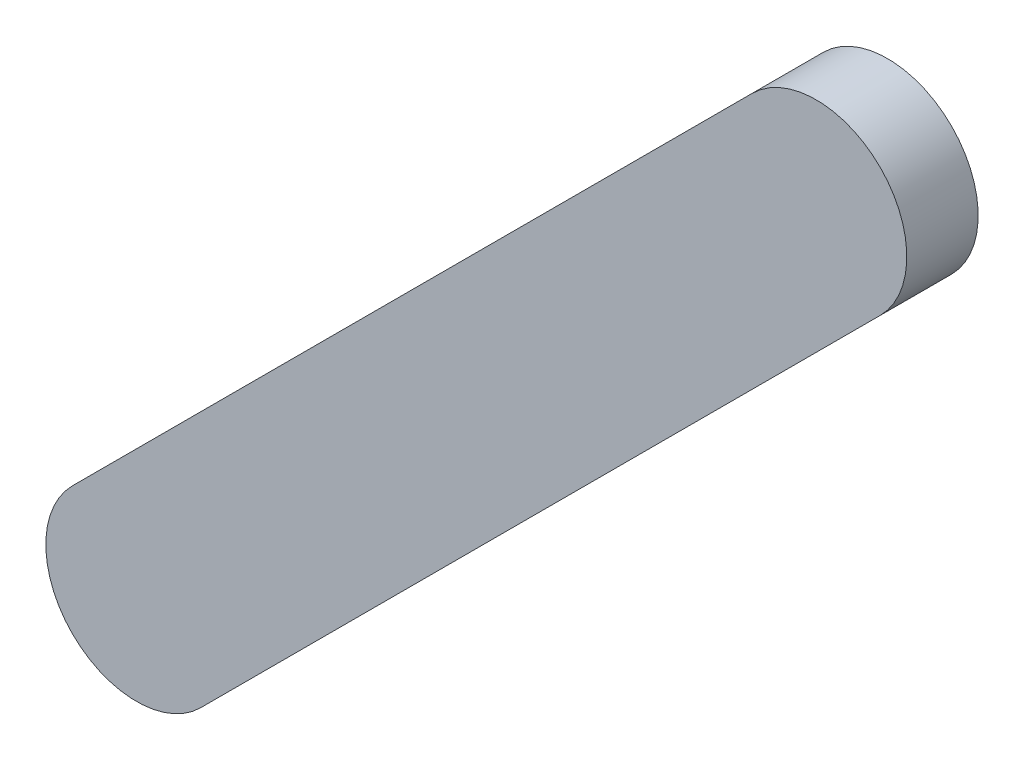
ISO-10303-21;
HEADER;
FILE_DESCRIPTION(('STEP AP214'),'2;1');
FILE_NAME('part.step','',(''),(''),'','','');
FILE_SCHEMA(('AUTOMOTIVE_DESIGN { 1 0 10303 214 1 1 1 1 }'));
ENDSEC;
DATA;
#1=APPLICATION_CONTEXT('core data for automotive mechanical design processes');
#2=APPLICATION_PROTOCOL_DEFINITION('international standard','automotive_design',2000,#1);
#3=PRODUCT_CONTEXT('',#1,'mechanical');
#4=PRODUCT('Part','Part','',(#3));
#5=PRODUCT_RELATED_PRODUCT_CATEGORY('part','',(#4));
#6=PRODUCT_DEFINITION_FORMATION('','',#4);
#7=PRODUCT_DEFINITION_CONTEXT('part definition',#1,'design');
#8=PRODUCT_DEFINITION('design','',#6,#7);
#9=PRODUCT_DEFINITION_SHAPE('','',#8);
#10=(LENGTH_UNIT() NAMED_UNIT(*) SI_UNIT(.MILLI.,.METRE.));
#11=(NAMED_UNIT(*) PLANE_ANGLE_UNIT() SI_UNIT($,.RADIAN.));
#12=(NAMED_UNIT(*) SI_UNIT($,.STERADIAN.) SOLID_ANGLE_UNIT());
#13=UNCERTAINTY_MEASURE_WITH_UNIT(LENGTH_MEASURE(1.E-05),#10,'distance_accuracy_value','');
#14=(GEOMETRIC_REPRESENTATION_CONTEXT(3) GLOBAL_UNCERTAINTY_ASSIGNED_CONTEXT((#13)) GLOBAL_UNIT_ASSIGNED_CONTEXT((#10,
#11,#12)) REPRESENTATION_CONTEXT('',''));
#15=CARTESIAN_POINT('',(0.,0.,0.));
#16=DIRECTION('',(0.,0.,1.));
#17=DIRECTION('',(1.,0.,0.));
#18=AXIS2_PLACEMENT_3D('',#15,#16,#17);
#19=CARTESIAN_POINT('',(85.65060594,90.43302462,0.));
#20=DIRECTION('',(-0.707106781186548,0.707106781186548,0.));
#21=DIRECTION('',(0.707106781186548,0.707106781186548,0.));
#22=AXIS2_PLACEMENT_3D('',#19,#20,#21);
#23=PLANE('',#22);
#24=DIRECTION('',(0.707106781186548,0.707106781186548,0.));
#25=VECTOR('',#24,1.);
#26=CARTESIAN_POINT('',(85.65060594,90.43302462,0.1999996));
#27=LINE('',#26,#25);
#28=CARTESIAN_POINT('',(85.65060594,90.43302462,0.1999996));
#29=VERTEX_POINT('',#28);
#30=CARTESIAN_POINT('',(87.55560594,92.33802462,0.1999996));
#31=VERTEX_POINT('',#30);
#32=EDGE_CURVE('E11',#29,#31,#27,.T.);
#33=ORIENTED_EDGE('',*,*,#32,.F.);
#34=DIRECTION('',(0.,0.,1.));
#35=VECTOR('',#34,1.);
#36=CARTESIAN_POINT('',(85.65060594,90.43302462,0.));
#37=LINE('',#36,#35);
#38=CARTESIAN_POINT('',(85.65060594,90.43302462,0.));
#39=VERTEX_POINT('',#38);
#40=EDGE_CURVE('E24',#39,#29,#37,.T.);
#41=ORIENTED_EDGE('',*,*,#40,.F.);
#42=DIRECTION('',(0.707106781186548,0.707106781186548,0.));
#43=VECTOR('',#42,1.);
#44=CARTESIAN_POINT('',(85.65060594,90.43302462,0.));
#45=LINE('',#44,#43);
#46=CARTESIAN_POINT('',(87.55560594,92.33802462,0.));
#47=VERTEX_POINT('',#46);
#48=EDGE_CURVE('E75',#39,#47,#45,.T.);
#49=ORIENTED_EDGE('',*,*,#48,.T.);
#50=DIRECTION('',(0.,0.,1.));
#51=VECTOR('',#50,1.);
#52=CARTESIAN_POINT('',(87.55560594,92.33802462,0.));
#53=LINE('',#52,#51);
#54=EDGE_CURVE('E37',#47,#31,#53,.T.);
#55=ORIENTED_EDGE('',*,*,#54,.T.);
#56=EDGE_LOOP('',(#33,#41,#49,#55));
#57=FACE_BOUND('',#56,.T.);
#58=ADVANCED_FACE('F17',(#57),#23,.F.);
#59=CARTESIAN_POINT('',(87.376,92.51763056,0.));
#60=DIRECTION('',(0.,0.,-1.));
#61=DIRECTION('',(0.70710678118652,-0.707106781186576,0.));
#62=AXIS2_PLACEMENT_3D('',#59,#60,#61);
#63=CYLINDRICAL_SURFACE('',#62,0.254001156230764);
#64=CARTESIAN_POINT('',(87.376,92.51763056,0.1999996));
#65=DIRECTION('',(0.,0.,1.));
#66=DIRECTION('',(0.70710678118652,-0.707106781186576,0.));
#67=AXIS2_PLACEMENT_3D('',#64,#65,#66);
#68=CIRCLE('',#67,0.254001156230764);
#69=CARTESIAN_POINT('',(87.19639406,92.6972365,0.1999996));
#70=VERTEX_POINT('',#69);
#71=EDGE_CURVE('E83',#31,#70,#68,.T.);
#72=ORIENTED_EDGE('',*,*,#71,.F.);
#73=ORIENTED_EDGE('',*,*,#54,.F.);
#74=CARTESIAN_POINT('',(87.376,92.51763056,0.));
#75=DIRECTION('',(0.,0.,1.));
#76=DIRECTION('',(0.70710678118652,-0.707106781186576,0.));
#77=AXIS2_PLACEMENT_3D('',#74,#75,#76);
#78=CIRCLE('',#77,0.254001156230764);
#79=CARTESIAN_POINT('',(87.19639406,92.6972365,0.));
#80=VERTEX_POINT('',#79);
#81=EDGE_CURVE('E81',#47,#80,#78,.T.);
#82=ORIENTED_EDGE('',*,*,#81,.T.);
#83=DIRECTION('',(0.,0.,1.));
#84=VECTOR('',#83,1.);
#85=CARTESIAN_POINT('',(87.19639406,92.6972365,0.));
#86=LINE('',#85,#84);
#87=EDGE_CURVE('E67',#80,#70,#86,.T.);
#88=ORIENTED_EDGE('',*,*,#87,.T.);
#89=EDGE_LOOP('',(#72,#73,#82,#88));
#90=FACE_BOUND('',#89,.T.);
#91=ADVANCED_FACE('F89',(#90),#63,.T.);
#92=CARTESIAN_POINT('',(87.19639406,92.6972365,0.));
#93=DIRECTION('',(0.707106781186548,-0.707106781186548,0.));
#94=DIRECTION('',(-0.707106781186548,-0.707106781186548,0.));
#95=AXIS2_PLACEMENT_3D('',#92,#93,#94);
#96=PLANE('',#95);
#97=DIRECTION('',(-0.707106781186548,-0.707106781186548,0.));
#98=VECTOR('',#97,1.);
#99=CARTESIAN_POINT('',(87.19639406,92.6972365,0.1999996));
#100=LINE('',#99,#98);
#101=CARTESIAN_POINT('',(85.29139406,90.7922365,0.1999996));
#102=VERTEX_POINT('',#101);
#103=EDGE_CURVE('E71',#70,#102,#100,.T.);
#104=ORIENTED_EDGE('',*,*,#103,.F.);
#105=ORIENTED_EDGE('',*,*,#87,.F.);
#106=DIRECTION('',(-0.707106781186548,-0.707106781186548,0.));
#107=VECTOR('',#106,1.);
#108=CARTESIAN_POINT('',(87.19639406,92.6972365,0.));
#109=LINE('',#108,#107);
#110=CARTESIAN_POINT('',(85.29139406,90.7922365,0.));
#111=VERTEX_POINT('',#110);
#112=EDGE_CURVE('E63',#80,#111,#109,.T.);
#113=ORIENTED_EDGE('',*,*,#112,.T.);
#114=DIRECTION('',(0.,0.,1.));
#115=VECTOR('',#114,1.);
#116=CARTESIAN_POINT('',(85.29139406,90.7922365,0.));
#117=LINE('',#116,#115);
#118=EDGE_CURVE('E53',#111,#102,#117,.T.);
#119=ORIENTED_EDGE('',*,*,#118,.T.);
#120=EDGE_LOOP('',(#104,#105,#113,#119));
#121=FACE_BOUND('',#120,.T.);
#122=ADVANCED_FACE('F66',(#121),#96,.F.);
#123=CARTESIAN_POINT('',(85.471,90.61263056,0.));
#124=DIRECTION('',(0.,0.,-1.));
#125=DIRECTION('',(-0.707106781186548,0.707106781186548,0.));
#126=AXIS2_PLACEMENT_3D('',#123,#124,#125);
#127=CYLINDRICAL_SURFACE('',#126,0.254001156230768);
#128=CARTESIAN_POINT('',(85.471,90.61263056,0.1999996));
#129=DIRECTION('',(0.,0.,1.));
#130=DIRECTION('',(-0.707106781186548,0.707106781186548,0.));
#131=AXIS2_PLACEMENT_3D('',#128,#129,#130);
#132=CIRCLE('',#131,0.254001156230768);
#133=EDGE_CURVE('E59',#102,#29,#132,.T.);
#134=ORIENTED_EDGE('',*,*,#133,.F.);
#135=ORIENTED_EDGE('',*,*,#118,.F.);
#136=CARTESIAN_POINT('',(85.471,90.61263056,0.));
#137=DIRECTION('',(0.,0.,1.));
#138=DIRECTION('',(-0.707106781186548,0.707106781186548,0.));
#139=AXIS2_PLACEMENT_3D('',#136,#137,#138);
#140=CIRCLE('',#139,0.254001156230768);
#141=EDGE_CURVE('E57',#111,#39,#140,.T.);
#142=ORIENTED_EDGE('',*,*,#141,.T.);
#143=ORIENTED_EDGE('',*,*,#40,.T.);
#144=EDGE_LOOP('',(#134,#135,#142,#143));
#145=FACE_BOUND('',#144,.T.);
#146=ADVANCED_FACE('F55',(#145),#127,.T.);
#147=CARTESIAN_POINT('',(85.65060594,90.43302462,0.));
#148=DIRECTION('',(0.,0.,-1.));
#149=DIRECTION('',(-1.,0.,0.));
#150=AXIS2_PLACEMENT_3D('',#147,#148,#149);
#151=PLANE('',#150);
#152=ORIENTED_EDGE('',*,*,#141,.F.);
#153=ORIENTED_EDGE('',*,*,#112,.F.);
#154=ORIENTED_EDGE('',*,*,#81,.F.);
#155=ORIENTED_EDGE('',*,*,#48,.F.);
#156=EDGE_LOOP('',(#152,#153,#154,#155));
#157=FACE_BOUND('',#156,.T.);
#158=ADVANCED_FACE('F74',(#157),#151,.T.);
#159=CARTESIAN_POINT('',(85.65060594,90.43302462,0.1999996));
#160=DIRECTION('',(0.,0.,-1.));
#161=DIRECTION('',(-1.,0.,0.));
#162=AXIS2_PLACEMENT_3D('',#159,#160,#161);
#163=PLANE('',#162);
#164=ORIENTED_EDGE('',*,*,#32,.T.);
#165=ORIENTED_EDGE('',*,*,#71,.T.);
#166=ORIENTED_EDGE('',*,*,#103,.T.);
#167=ORIENTED_EDGE('',*,*,#133,.T.);
#168=EDGE_LOOP('',(#164,#165,#166,#167));
#169=FACE_BOUND('',#168,.T.);
#170=ADVANCED_FACE('F91',(#169),#163,.F.);
#171=CLOSED_SHELL('',(#58,#91,#122,#146,#158,#170));
#172=MANIFOLD_SOLID_BREP('B1',#171);
#173=ADVANCED_BREP_SHAPE_REPRESENTATION('',(#18,#172),#14);
#174=SHAPE_DEFINITION_REPRESENTATION(#9,#173);
ENDSEC;
END-ISO-10303-21;
